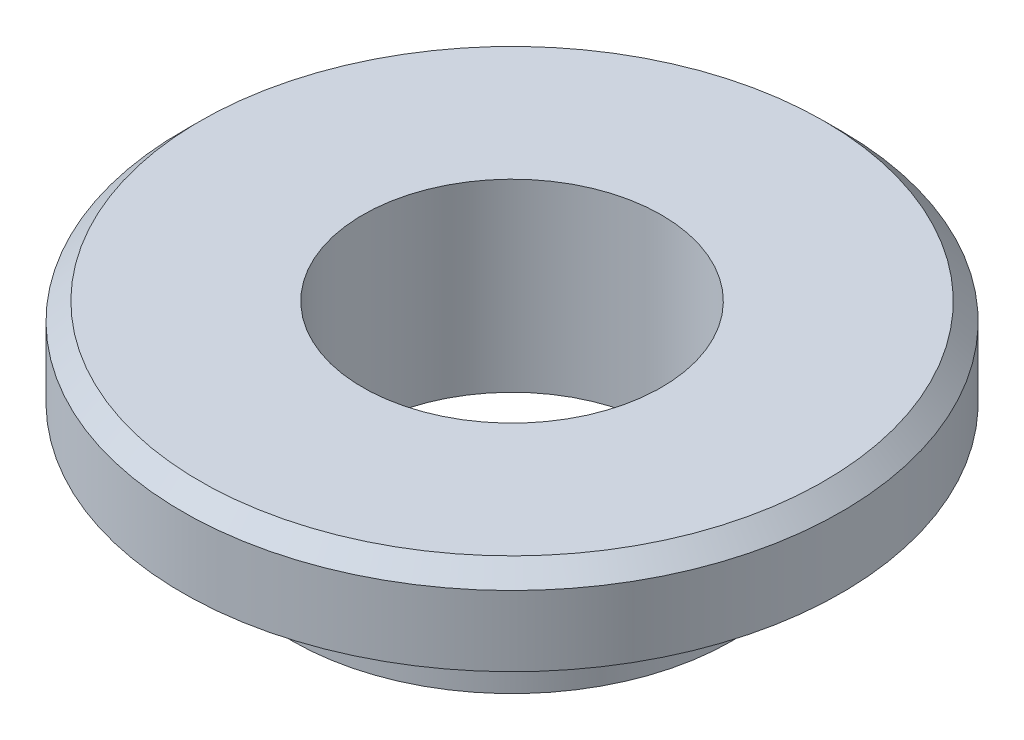
ISO-10303-21;
HEADER;
FILE_DESCRIPTION(('STEP AP214'),'2;1');
FILE_NAME('part.step','',(''),(''),'','','');
FILE_SCHEMA(('AUTOMOTIVE_DESIGN { 1 0 10303 214 1 1 1 1 }'));
ENDSEC;
DATA;
#1=APPLICATION_CONTEXT('core data for automotive mechanical design processes');
#2=APPLICATION_PROTOCOL_DEFINITION('international standard','automotive_design',2000,#1);
#3=PRODUCT_CONTEXT('',#1,'mechanical');
#4=PRODUCT('Part','Part','',(#3));
#5=PRODUCT_RELATED_PRODUCT_CATEGORY('part','',(#4));
#6=PRODUCT_DEFINITION_FORMATION('','',#4);
#7=PRODUCT_DEFINITION_CONTEXT('part definition',#1,'design');
#8=PRODUCT_DEFINITION('design','',#6,#7);
#9=PRODUCT_DEFINITION_SHAPE('','',#8);
#10=(LENGTH_UNIT() NAMED_UNIT(*) SI_UNIT(.MILLI.,.METRE.));
#11=(NAMED_UNIT(*) PLANE_ANGLE_UNIT() SI_UNIT($,.RADIAN.));
#12=(NAMED_UNIT(*) SI_UNIT($,.STERADIAN.) SOLID_ANGLE_UNIT());
#13=UNCERTAINTY_MEASURE_WITH_UNIT(LENGTH_MEASURE(1.E-05),#10,'distance_accuracy_value','');
#14=(GEOMETRIC_REPRESENTATION_CONTEXT(3) GLOBAL_UNCERTAINTY_ASSIGNED_CONTEXT((#13)) GLOBAL_UNIT_ASSIGNED_CONTEXT((#10,
#11,#12)) REPRESENTATION_CONTEXT('',''));
#15=CARTESIAN_POINT('',(0.,0.,0.));
#16=DIRECTION('',(0.,0.,1.));
#17=DIRECTION('',(1.,0.,0.));
#18=AXIS2_PLACEMENT_3D('',#15,#16,#17);
#19=CARTESIAN_POINT('',(4.5085,2.667,0.));
#20=DIRECTION('',(0.,1.,0.));
#21=DIRECTION('',(0.,0.,1.));
#22=AXIS2_PLACEMENT_3D('',#19,#20,#21);
#23=PLANE('',#22);
#24=CARTESIAN_POINT('',(0.,2.667,0.));
#25=DIRECTION('',(0.,-1.,0.));
#26=DIRECTION('',(0.,0.,-1.));
#27=AXIS2_PLACEMENT_3D('',#24,#25,#26);
#28=CIRCLE('',#27,2.159);
#29=CARTESIAN_POINT('',(0.,2.667,-2.159));
#30=VERTEX_POINT('',#29);
#31=EDGE_CURVE('E10',#30,#30,#28,.T.);
#32=ORIENTED_EDGE('',*,*,#31,.T.);
#33=EDGE_LOOP('',(#32));
#34=FACE_BOUND('',#33,.T.);
#35=CARTESIAN_POINT('',(0.,2.667,0.));
#36=DIRECTION('',(0.,-1.,0.));
#37=DIRECTION('',(0.,0.,-1.));
#38=AXIS2_PLACEMENT_3D('',#35,#36,#37);
#39=CIRCLE('',#38,4.5085);
#40=CARTESIAN_POINT('',(0.,2.667,-4.5085));
#41=VERTEX_POINT('',#40);
#42=EDGE_CURVE('E57',#41,#41,#39,.T.);
#43=ORIENTED_EDGE('',*,*,#42,.F.);
#44=EDGE_LOOP('',(#43));
#45=FACE_BOUND('',#44,.T.);
#46=ADVANCED_FACE('F32',(#34,#45),#23,.T.);
#47=CARTESIAN_POINT('',(0.,0.,0.));
#48=DIRECTION('',(0.,-1.,0.));
#49=DIRECTION('',(0.,0.,-1.));
#50=AXIS2_PLACEMENT_3D('',#47,#48,#49);
#51=CYLINDRICAL_SURFACE('',#50,2.159);
#52=CARTESIAN_POINT('',(0.,0.,0.));
#53=DIRECTION('',(0.,-1.,0.));
#54=DIRECTION('',(0.,0.,-1.));
#55=AXIS2_PLACEMENT_3D('',#52,#53,#54);
#56=CIRCLE('',#55,2.159);
#57=CARTESIAN_POINT('',(0.,0.,-2.159));
#58=VERTEX_POINT('',#57);
#59=EDGE_CURVE('E38',#58,#58,#56,.T.);
#60=ORIENTED_EDGE('',*,*,#59,.T.);
#61=EDGE_LOOP('',(#60));
#62=FACE_BOUND('',#61,.T.);
#63=ORIENTED_EDGE('',*,*,#31,.F.);
#64=EDGE_LOOP('',(#63));
#65=FACE_BOUND('',#64,.T.);
#66=ADVANCED_FACE('F65',(#62,#65),#51,.F.);
#67=CARTESIAN_POINT('',(2.159,0.,0.));
#68=DIRECTION('',(0.,-1.,0.));
#69=DIRECTION('',(0.,0.,-1.));
#70=AXIS2_PLACEMENT_3D('',#67,#68,#69);
#71=PLANE('',#70);
#72=CARTESIAN_POINT('',(0.,0.,0.));
#73=DIRECTION('',(0.,-1.,0.));
#74=DIRECTION('',(0.,0.,-1.));
#75=AXIS2_PLACEMENT_3D('',#72,#73,#74);
#76=CIRCLE('',#75,3.175);
#77=CARTESIAN_POINT('',(0.,0.,-3.175));
#78=VERTEX_POINT('',#77);
#79=EDGE_CURVE('E42',#78,#78,#76,.T.);
#80=ORIENTED_EDGE('',*,*,#79,.T.);
#81=EDGE_LOOP('',(#80));
#82=FACE_BOUND('',#81,.T.);
#83=ORIENTED_EDGE('',*,*,#59,.F.);
#84=EDGE_LOOP('',(#83));
#85=FACE_BOUND('',#84,.T.);
#86=ADVANCED_FACE('F69',(#82,#85),#71,.T.);
#87=CARTESIAN_POINT('',(0.,0.,0.));
#88=DIRECTION('',(0.,-1.,0.));
#89=DIRECTION('',(0.,0.,-1.));
#90=AXIS2_PLACEMENT_3D('',#87,#88,#89);
#91=CYLINDRICAL_SURFACE('',#90,3.175);
#92=CARTESIAN_POINT('',(0.,1.397,0.));
#93=DIRECTION('',(0.,-1.,0.));
#94=DIRECTION('',(0.,0.,-1.));
#95=AXIS2_PLACEMENT_3D('',#92,#93,#94);
#96=CIRCLE('',#95,3.175);
#97=CARTESIAN_POINT('',(0.,1.397,-3.175));
#98=VERTEX_POINT('',#97);
#99=EDGE_CURVE('E46',#98,#98,#96,.T.);
#100=ORIENTED_EDGE('',*,*,#99,.T.);
#101=EDGE_LOOP('',(#100));
#102=FACE_BOUND('',#101,.T.);
#103=ORIENTED_EDGE('',*,*,#79,.F.);
#104=EDGE_LOOP('',(#103));
#105=FACE_BOUND('',#104,.T.);
#106=ADVANCED_FACE('F73',(#102,#105),#91,.T.);
#107=CARTESIAN_POINT('',(3.175,1.397,0.));
#108=DIRECTION('',(0.,-1.,0.));
#109=DIRECTION('',(0.,0.,-1.));
#110=AXIS2_PLACEMENT_3D('',#107,#108,#109);
#111=PLANE('',#110);
#112=CARTESIAN_POINT('',(0.,1.397,0.));
#113=DIRECTION('',(0.,-1.,0.));
#114=DIRECTION('',(0.,0.,-1.));
#115=AXIS2_PLACEMENT_3D('',#112,#113,#114);
#116=CIRCLE('',#115,4.7625);
#117=CARTESIAN_POINT('',(0.,1.397,-4.7625));
#118=VERTEX_POINT('',#117);
#119=EDGE_CURVE('E51',#118,#118,#116,.T.);
#120=ORIENTED_EDGE('',*,*,#119,.T.);
#121=EDGE_LOOP('',(#120));
#122=FACE_BOUND('',#121,.T.);
#123=ORIENTED_EDGE('',*,*,#99,.F.);
#124=EDGE_LOOP('',(#123));
#125=FACE_BOUND('',#124,.T.);
#126=ADVANCED_FACE('F80',(#122,#125),#111,.T.);
#127=CARTESIAN_POINT('',(0.,0.,0.));
#128=DIRECTION('',(0.,-1.,0.));
#129=DIRECTION('',(0.,0.,-1.));
#130=AXIS2_PLACEMENT_3D('',#127,#128,#129);
#131=CYLINDRICAL_SURFACE('',#130,4.7625);
#132=CARTESIAN_POINT('',(0.,2.413,0.));
#133=DIRECTION('',(0.,-1.,0.));
#134=DIRECTION('',(0.,0.,-1.));
#135=AXIS2_PLACEMENT_3D('',#132,#133,#134);
#136=CIRCLE('',#135,4.7625);
#137=CARTESIAN_POINT('',(0.,2.413,-4.7625));
#138=VERTEX_POINT('',#137);
#139=EDGE_CURVE('E54',#138,#138,#136,.T.);
#140=ORIENTED_EDGE('',*,*,#139,.T.);
#141=EDGE_LOOP('',(#140));
#142=FACE_BOUND('',#141,.T.);
#143=ORIENTED_EDGE('',*,*,#119,.F.);
#144=EDGE_LOOP('',(#143));
#145=FACE_BOUND('',#144,.T.);
#146=ADVANCED_FACE('F84',(#142,#145),#131,.T.);
#147=CARTESIAN_POINT('',(0.,2.413,0.));
#148=DIRECTION('',(0.,-1.,0.));
#149=DIRECTION('',(0.,0.,-1.));
#150=AXIS2_PLACEMENT_3D('',#147,#148,#149);
#151=CONICAL_SURFACE('',#150,4.7625,0.785398163397454);
#152=ORIENTED_EDGE('',*,*,#42,.T.);
#153=EDGE_LOOP('',(#152));
#154=FACE_BOUND('',#153,.T.);
#155=ORIENTED_EDGE('',*,*,#139,.F.);
#156=EDGE_LOOP('',(#155));
#157=FACE_BOUND('',#156,.T.);
#158=ADVANCED_FACE('F61',(#154,#157),#151,.T.);
#159=CLOSED_SHELL('',(#46,#66,#86,#106,#126,#146,#158));
#160=MANIFOLD_SOLID_BREP('B2',#159);
#161=ADVANCED_BREP_SHAPE_REPRESENTATION('',(#18,#160),#14);
#162=SHAPE_DEFINITION_REPRESENTATION(#9,#161);
ENDSEC;
END-ISO-10303-21;
